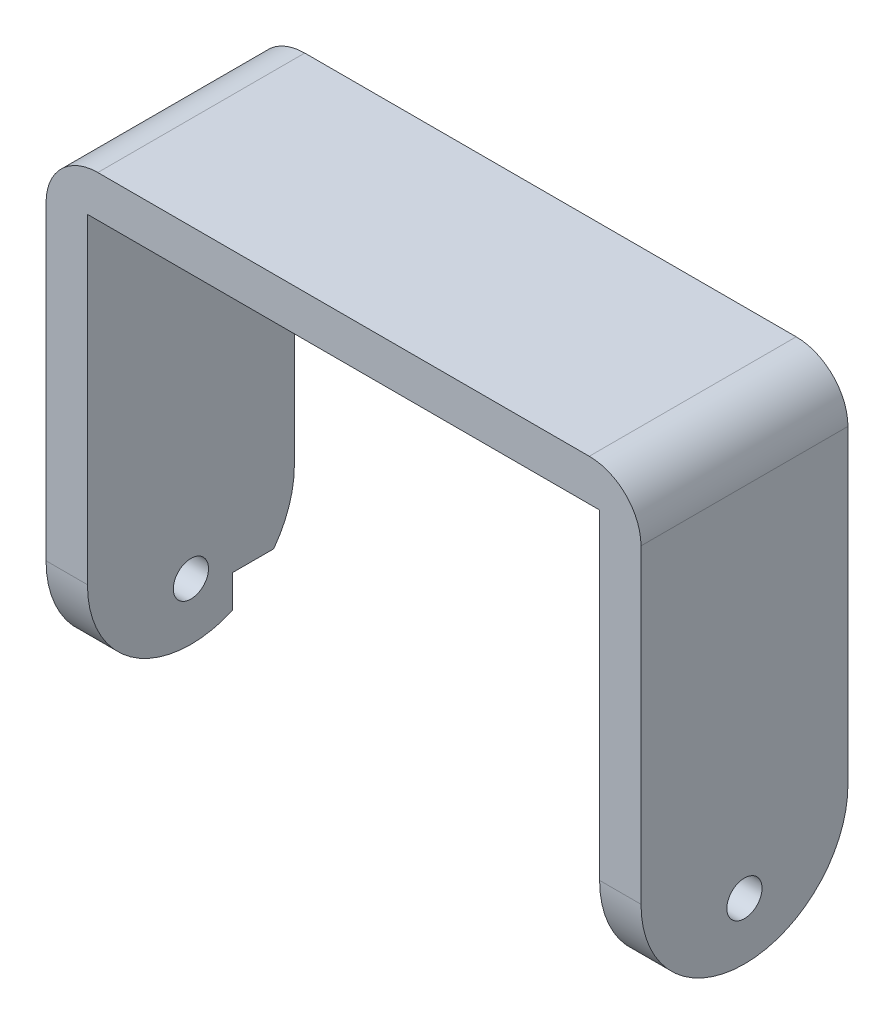
ISO-10303-21;
HEADER;
FILE_DESCRIPTION(('STEP AP214'),'2;1');
FILE_NAME('part.step','',(''),(''),'','','');
FILE_SCHEMA(('AUTOMOTIVE_DESIGN { 1 0 10303 214 1 1 1 1 }'));
ENDSEC;
DATA;
#1=APPLICATION_CONTEXT('core data for automotive mechanical design processes');
#2=APPLICATION_PROTOCOL_DEFINITION('international standard','automotive_design',2000,#1);
#3=PRODUCT_CONTEXT('',#1,'mechanical');
#4=PRODUCT('Part','Part','',(#3));
#5=PRODUCT_RELATED_PRODUCT_CATEGORY('part','',(#4));
#6=PRODUCT_DEFINITION_FORMATION('','',#4);
#7=PRODUCT_DEFINITION_CONTEXT('part definition',#1,'design');
#8=PRODUCT_DEFINITION('design','',#6,#7);
#9=PRODUCT_DEFINITION_SHAPE('','',#8);
#10=(LENGTH_UNIT() NAMED_UNIT(*) SI_UNIT(.MILLI.,.METRE.));
#11=(NAMED_UNIT(*) PLANE_ANGLE_UNIT() SI_UNIT($,.RADIAN.));
#12=(NAMED_UNIT(*) SI_UNIT($,.STERADIAN.) SOLID_ANGLE_UNIT());
#13=UNCERTAINTY_MEASURE_WITH_UNIT(LENGTH_MEASURE(1.E-05),#10,'distance_accuracy_value','');
#14=(GEOMETRIC_REPRESENTATION_CONTEXT(3) GLOBAL_UNCERTAINTY_ASSIGNED_CONTEXT((#13)) GLOBAL_UNIT_ASSIGNED_CONTEXT((#10,
#11,#12)) REPRESENTATION_CONTEXT('',''));
#15=CARTESIAN_POINT('',(0.,0.,0.));
#16=DIRECTION('',(0.,0.,1.));
#17=DIRECTION('',(1.,0.,0.));
#18=AXIS2_PLACEMENT_3D('',#15,#16,#17);
#19=CARTESIAN_POINT('',(0.,10.,10.));
#20=DIRECTION('',(1.,0.,0.));
#21=DIRECTION('',(0.,0.,-1.));
#22=AXIS2_PLACEMENT_3D('',#19,#20,#21);
#23=CYLINDRICAL_SURFACE('',#22,10.);
#24=DIRECTION('',(-1.,0.,0.));
#25=VECTOR('',#24,1.);
#26=CARTESIAN_POINT('',(9.10080222328407,4.,2.));
#27=LINE('',#26,#25);
#28=CARTESIAN_POINT('',(3.99999999999999,4.,2.));
#29=VERTEX_POINT('',#28);
#30=CARTESIAN_POINT('',(0.,4.,2.));
#31=VERTEX_POINT('',#30);
#32=EDGE_CURVE('E298',#29,#31,#27,.T.);
#33=ORIENTED_EDGE('',*,*,#32,.T.);
#34=CARTESIAN_POINT('',(0.,10.,10.));
#35=DIRECTION('',(1.,0.,0.));
#36=DIRECTION('',(0.,0.,-1.));
#37=AXIS2_PLACEMENT_3D('',#34,#35,#36);
#38=CIRCLE('',#37,10.);
#39=CARTESIAN_POINT('',(0.,10.,0.));
#40=VERTEX_POINT('',#39);
#41=EDGE_CURVE('E172',#40,#31,#38,.F.);
#42=ORIENTED_EDGE('',*,*,#41,.F.);
#43=DIRECTION('',(1.,0.,0.));
#44=VECTOR('',#43,1.);
#45=CARTESIAN_POINT('',(0.,10.,0.));
#46=LINE('',#45,#44);
#47=CARTESIAN_POINT('',(3.99999999999999,10.,0.));
#48=VERTEX_POINT('',#47);
#49=EDGE_CURVE('E257',#48,#40,#46,.F.);
#50=ORIENTED_EDGE('',*,*,#49,.F.);
#51=CARTESIAN_POINT('',(3.99999999999999,10.,10.));
#52=DIRECTION('',(-1.,0.,0.));
#53=DIRECTION('',(0.,-1.,0.));
#54=AXIS2_PLACEMENT_3D('',#51,#52,#53);
#55=CIRCLE('',#54,10.);
#56=EDGE_CURVE('E278',#29,#48,#55,.F.);
#57=ORIENTED_EDGE('',*,*,#56,.F.);
#58=EDGE_LOOP('',(#33,#42,#50,#57));
#59=FACE_BOUND('',#58,.T.);
#60=ADVANCED_FACE('F38',(#59),#23,.T.);
#61=CARTESIAN_POINT('',(0.,45.,20.));
#62=DIRECTION('',(1.,0.,0.));
#63=DIRECTION('',(0.,0.,-1.));
#64=AXIS2_PLACEMENT_3D('',#61,#62,#63);
#65=PLANE('',#64);
#66=ORIENTED_EDGE('',*,*,#41,.T.);
#67=DIRECTION('',(0.,0.,-1.));
#68=VECTOR('',#67,1.);
#69=CARTESIAN_POINT('',(0.,4.,2.));
#70=LINE('',#69,#68);
#71=CARTESIAN_POINT('',(0.,4.,6.));
#72=VERTEX_POINT('',#71);
#73=EDGE_CURVE('E156',#72,#31,#70,.T.);
#74=ORIENTED_EDGE('',*,*,#73,.F.);
#75=DIRECTION('',(0.,1.,0.));
#76=VECTOR('',#75,1.);
#77=CARTESIAN_POINT('',(0.,4.,6.));
#78=LINE('',#77,#76);
#79=CARTESIAN_POINT('',(0.,0.83484861008832,6.));
#80=VERTEX_POINT('',#79);
#81=EDGE_CURVE('E148',#80,#72,#78,.T.);
#82=ORIENTED_EDGE('',*,*,#81,.F.);
#83=CARTESIAN_POINT('',(0.,0.,10.));
#84=VERTEX_POINT('',#83);
#85=EDGE_CURVE('E163',#80,#84,#38,.F.);
#86=ORIENTED_EDGE('',*,*,#85,.T.);
#87=CARTESIAN_POINT('',(0.,10.,10.));
#88=DIRECTION('',(1.,0.,0.));
#89=DIRECTION('',(0.,0.,-1.));
#90=AXIS2_PLACEMENT_3D('',#87,#88,#89);
#91=CIRCLE('',#90,10.);
#92=CARTESIAN_POINT('',(0.,10.,20.));
#93=VERTEX_POINT('',#92);
#94=EDGE_CURVE('E173',#84,#93,#91,.F.);
#95=ORIENTED_EDGE('',*,*,#94,.T.);
#96=DIRECTION('',(0.,-1.,0.));
#97=VECTOR('',#96,1.);
#98=CARTESIAN_POINT('',(0.,45.,20.));
#99=LINE('',#98,#97);
#100=CARTESIAN_POINT('',(0.,40.,20.));
#101=VERTEX_POINT('',#100);
#102=EDGE_CURVE('E213',#101,#93,#99,.T.);
#103=ORIENTED_EDGE('',*,*,#102,.F.);
#104=DIRECTION('',(0.,0.,-1.));
#105=VECTOR('',#104,1.);
#106=CARTESIAN_POINT('',(0.,40.,20.));
#107=LINE('',#106,#105);
#108=CARTESIAN_POINT('',(0.,40.,0.));
#109=VERTEX_POINT('',#108);
#110=EDGE_CURVE('E177',#101,#109,#107,.T.);
#111=ORIENTED_EDGE('',*,*,#110,.T.);
#112=DIRECTION('',(0.,-1.,0.));
#113=VECTOR('',#112,1.);
#114=CARTESIAN_POINT('',(0.,45.,0.));
#115=LINE('',#114,#113);
#116=EDGE_CURVE('E231',#109,#40,#115,.T.);
#117=ORIENTED_EDGE('',*,*,#116,.T.);
#118=EDGE_LOOP('',(#66,#74,#82,#86,#95,#103,#111,#117));
#119=FACE_BOUND('',#118,.T.);
#120=CARTESIAN_POINT('',(0.,5.5,10.));
#121=DIRECTION('',(1.,0.,0.));
#122=DIRECTION('',(0.,0.,-1.));
#123=AXIS2_PLACEMENT_3D('',#120,#121,#122);
#124=CIRCLE('',#123,1.69999999999999);
#125=CARTESIAN_POINT('',(0.,5.5,8.30000000000001));
#126=VERTEX_POINT('',#125);
#127=EDGE_CURVE('E343',#126,#126,#124,.F.);
#128=ORIENTED_EDGE('',*,*,#127,.F.);
#129=EDGE_LOOP('',(#128));
#130=FACE_BOUND('',#129,.T.);
#131=ADVANCED_FACE('F160',(#119,#130),#65,.F.);
#132=CARTESIAN_POINT('',(3.99999999999999,0.,20.));
#133=DIRECTION('',(-1.,0.,0.));
#134=DIRECTION('',(0.,-1.,0.));
#135=AXIS2_PLACEMENT_3D('',#132,#133,#134);
#136=PLANE('',#135);
#137=CARTESIAN_POINT('',(3.99999999999999,5.5,10.));
#138=DIRECTION('',(-1.,0.,0.));
#139=DIRECTION('',(0.,-1.,0.));
#140=AXIS2_PLACEMENT_3D('',#137,#138,#139);
#141=CIRCLE('',#140,1.69999999999999);
#142=CARTESIAN_POINT('',(3.99999999999999,3.80000000000001,10.));
#143=VERTEX_POINT('',#142);
#144=EDGE_CURVE('E300',#143,#143,#141,.T.);
#145=ORIENTED_EDGE('',*,*,#144,.T.);
#146=EDGE_LOOP('',(#145));
#147=FACE_BOUND('',#146,.T.);
#148=DIRECTION('',(0.,-1.,0.));
#149=VECTOR('',#148,1.);
#150=CARTESIAN_POINT('',(3.99999999999999,4.,6.));
#151=LINE('',#150,#149);
#152=CARTESIAN_POINT('',(3.99999999999999,4.,6.));
#153=VERTEX_POINT('',#152);
#154=CARTESIAN_POINT('',(3.99999999999999,0.834848610088321,6.));
#155=VERTEX_POINT('',#154);
#156=EDGE_CURVE('E54',#153,#155,#151,.T.);
#157=ORIENTED_EDGE('',*,*,#156,.F.);
#158=DIRECTION('',(0.,0.,1.));
#159=VECTOR('',#158,1.);
#160=CARTESIAN_POINT('',(3.99999999999999,4.,2.));
#161=LINE('',#160,#159);
#162=EDGE_CURVE('E288',#29,#153,#161,.T.);
#163=ORIENTED_EDGE('',*,*,#162,.F.);
#164=ORIENTED_EDGE('',*,*,#56,.T.);
#165=DIRECTION('',(0.,1.,0.));
#166=VECTOR('',#165,1.);
#167=CARTESIAN_POINT('',(3.99999999999999,0.,0.));
#168=LINE('',#167,#166);
#169=CARTESIAN_POINT('',(4.,41.,0.));
#170=VERTEX_POINT('',#169);
#171=EDGE_CURVE('E287',#48,#170,#168,.T.);
#172=ORIENTED_EDGE('',*,*,#171,.T.);
#173=DIRECTION('',(0.,0.,-1.));
#174=VECTOR('',#173,1.);
#175=CARTESIAN_POINT('',(4.,41.,20.));
#176=LINE('',#175,#174);
#177=CARTESIAN_POINT('',(4.,41.,20.));
#178=VERTEX_POINT('',#177);
#179=EDGE_CURVE('E247',#178,#170,#176,.T.);
#180=ORIENTED_EDGE('',*,*,#179,.F.);
#181=DIRECTION('',(0.,1.,0.));
#182=VECTOR('',#181,1.);
#183=CARTESIAN_POINT('',(3.99999999999999,0.,20.));
#184=LINE('',#183,#182);
#185=CARTESIAN_POINT('',(3.99999999999999,10.,20.));
#186=VERTEX_POINT('',#185);
#187=EDGE_CURVE('E222',#186,#178,#184,.T.);
#188=ORIENTED_EDGE('',*,*,#187,.F.);
#189=CARTESIAN_POINT('',(3.99999999999999,10.,10.));
#190=DIRECTION('',(-1.,0.,0.));
#191=DIRECTION('',(0.,-1.,0.));
#192=AXIS2_PLACEMENT_3D('',#189,#190,#191);
#193=CIRCLE('',#192,10.);
#194=CARTESIAN_POINT('',(3.99999999999999,0.,10.));
#195=VERTEX_POINT('',#194);
#196=EDGE_CURVE('E276',#186,#195,#193,.F.);
#197=ORIENTED_EDGE('',*,*,#196,.T.);
#198=EDGE_CURVE('E178',#195,#155,#55,.F.);
#199=ORIENTED_EDGE('',*,*,#198,.T.);
#200=EDGE_LOOP('',(#157,#163,#164,#172,#180,#188,#197,#199));
#201=FACE_BOUND('',#200,.T.);
#202=ADVANCED_FACE('F285',(#147,#201),#136,.F.);
#203=CARTESIAN_POINT('',(4.,41.,20.));
#204=DIRECTION('',(0.,1.,0.));
#205=DIRECTION('',(0.,0.,1.));
#206=AXIS2_PLACEMENT_3D('',#203,#204,#205);
#207=PLANE('',#206);
#208=DIRECTION('',(1.,0.,0.));
#209=VECTOR('',#208,1.);
#210=CARTESIAN_POINT('',(4.,41.,0.));
#211=LINE('',#210,#209);
#212=CARTESIAN_POINT('',(53.5,41.,0.));
#213=VERTEX_POINT('',#212);
#214=EDGE_CURVE('E294',#170,#213,#211,.T.);
#215=ORIENTED_EDGE('',*,*,#214,.T.);
#216=DIRECTION('',(0.,0.,-1.));
#217=VECTOR('',#216,1.);
#218=CARTESIAN_POINT('',(53.5,41.,20.));
#219=LINE('',#218,#217);
#220=CARTESIAN_POINT('',(53.5,41.,20.));
#221=VERTEX_POINT('',#220);
#222=EDGE_CURVE('E243',#221,#213,#219,.T.);
#223=ORIENTED_EDGE('',*,*,#222,.F.);
#224=DIRECTION('',(1.,0.,0.));
#225=VECTOR('',#224,1.);
#226=CARTESIAN_POINT('',(4.,41.,20.));
#227=LINE('',#226,#225);
#228=EDGE_CURVE('E330',#178,#221,#227,.T.);
#229=ORIENTED_EDGE('',*,*,#228,.F.);
#230=ORIENTED_EDGE('',*,*,#179,.T.);
#231=EDGE_LOOP('',(#215,#223,#229,#230));
#232=FACE_BOUND('',#231,.T.);
#233=ADVANCED_FACE('F394',(#232),#207,.F.);
#234=CARTESIAN_POINT('',(53.5,41.,20.));
#235=DIRECTION('',(1.,0.,0.));
#236=DIRECTION('',(0.,1.,0.));
#237=AXIS2_PLACEMENT_3D('',#234,#235,#236);
#238=PLANE('',#237);
#239=CARTESIAN_POINT('',(53.5,5.5,10.));
#240=DIRECTION('',(1.,0.,0.));
#241=DIRECTION('',(0.,1.,0.));
#242=AXIS2_PLACEMENT_3D('',#239,#240,#241);
#243=CIRCLE('',#242,1.69999999999999);
#244=CARTESIAN_POINT('',(53.5,7.19999999999999,10.));
#245=VERTEX_POINT('',#244);
#246=EDGE_CURVE('E304',#245,#245,#243,.T.);
#247=ORIENTED_EDGE('',*,*,#246,.T.);
#248=EDGE_LOOP('',(#247));
#249=FACE_BOUND('',#248,.T.);
#250=DIRECTION('',(0.,-1.,0.));
#251=VECTOR('',#250,1.);
#252=CARTESIAN_POINT('',(53.5,41.,0.));
#253=LINE('',#252,#251);
#254=CARTESIAN_POINT('',(53.5,10.,0.));
#255=VERTEX_POINT('',#254);
#256=EDGE_CURVE('E239',#213,#255,#253,.T.);
#257=ORIENTED_EDGE('',*,*,#256,.T.);
#258=CARTESIAN_POINT('',(53.5,10.,10.));
#259=DIRECTION('',(1.,0.,0.));
#260=DIRECTION('',(0.,1.,0.));
#261=AXIS2_PLACEMENT_3D('',#258,#259,#260);
#262=CIRCLE('',#261,10.);
#263=CARTESIAN_POINT('',(53.5,0.,10.));
#264=VERTEX_POINT('',#263);
#265=EDGE_CURVE('E267',#255,#264,#262,.F.);
#266=ORIENTED_EDGE('',*,*,#265,.T.);
#267=CARTESIAN_POINT('',(53.5,10.,10.));
#268=DIRECTION('',(1.,0.,0.));
#269=DIRECTION('',(0.,1.,0.));
#270=AXIS2_PLACEMENT_3D('',#267,#268,#269);
#271=CIRCLE('',#270,10.);
#272=CARTESIAN_POINT('',(53.5,10.,20.));
#273=VERTEX_POINT('',#272);
#274=EDGE_CURVE('E264',#264,#273,#271,.F.);
#275=ORIENTED_EDGE('',*,*,#274,.T.);
#276=DIRECTION('',(0.,-1.,0.));
#277=VECTOR('',#276,1.);
#278=CARTESIAN_POINT('',(53.5,41.,20.));
#279=LINE('',#278,#277);
#280=EDGE_CURVE('E328',#221,#273,#279,.T.);
#281=ORIENTED_EDGE('',*,*,#280,.F.);
#282=ORIENTED_EDGE('',*,*,#222,.T.);
#283=EDGE_LOOP('',(#257,#266,#275,#281,#282));
#284=FACE_BOUND('',#283,.T.);
#285=ADVANCED_FACE('F313',(#249,#284),#238,.F.);
#286=CARTESIAN_POINT('',(57.5,0.,20.));
#287=DIRECTION('',(-1.,0.,0.));
#288=DIRECTION('',(0.,0.,1.));
#289=AXIS2_PLACEMENT_3D('',#286,#287,#288);
#290=PLANE('',#289);
#291=CARTESIAN_POINT('',(57.5,5.5,10.));
#292=DIRECTION('',(1.,0.,0.));
#293=DIRECTION('',(0.,0.,-1.));
#294=AXIS2_PLACEMENT_3D('',#291,#292,#293);
#295=CIRCLE('',#294,1.69999999999999);
#296=CARTESIAN_POINT('',(57.5,5.5,8.30000000000001));
#297=VERTEX_POINT('',#296);
#298=EDGE_CURVE('E186',#297,#297,#295,.T.);
#299=ORIENTED_EDGE('',*,*,#298,.F.);
#300=EDGE_LOOP('',(#299));
#301=FACE_BOUND('',#300,.T.);
#302=DIRECTION('',(0.,1.,0.));
#303=VECTOR('',#302,1.);
#304=CARTESIAN_POINT('',(57.5,0.,0.));
#305=LINE('',#304,#303);
#306=CARTESIAN_POINT('',(57.5,10.,0.));
#307=VERTEX_POINT('',#306);
#308=CARTESIAN_POINT('',(57.5,40.,0.));
#309=VERTEX_POINT('',#308);
#310=EDGE_CURVE('E236',#307,#309,#305,.T.);
#311=ORIENTED_EDGE('',*,*,#310,.T.);
#312=DIRECTION('',(0.,0.,-1.));
#313=VECTOR('',#312,1.);
#314=CARTESIAN_POINT('',(57.5,40.,20.));
#315=LINE('',#314,#313);
#316=CARTESIAN_POINT('',(57.5,40.,20.));
#317=VERTEX_POINT('',#316);
#318=EDGE_CURVE('E11',#309,#317,#315,.F.);
#319=ORIENTED_EDGE('',*,*,#318,.T.);
#320=DIRECTION('',(0.,1.,0.));
#321=VECTOR('',#320,1.);
#322=CARTESIAN_POINT('',(57.5,0.,20.));
#323=LINE('',#322,#321);
#324=CARTESIAN_POINT('',(57.5,10.,20.));
#325=VERTEX_POINT('',#324);
#326=EDGE_CURVE('E332',#325,#317,#323,.T.);
#327=ORIENTED_EDGE('',*,*,#326,.F.);
#328=CARTESIAN_POINT('',(57.5,10.,10.));
#329=DIRECTION('',(-1.,0.,0.));
#330=DIRECTION('',(0.,0.,1.));
#331=AXIS2_PLACEMENT_3D('',#328,#329,#330);
#332=CIRCLE('',#331,10.);
#333=CARTESIAN_POINT('',(57.5,0.,10.));
#334=VERTEX_POINT('',#333);
#335=EDGE_CURVE('E251',#325,#334,#332,.F.);
#336=ORIENTED_EDGE('',*,*,#335,.T.);
#337=CARTESIAN_POINT('',(57.5,10.,10.));
#338=DIRECTION('',(-1.,0.,0.));
#339=DIRECTION('',(0.,0.,1.));
#340=AXIS2_PLACEMENT_3D('',#337,#338,#339);
#341=CIRCLE('',#340,10.);
#342=EDGE_CURVE('E254',#334,#307,#341,.F.);
#343=ORIENTED_EDGE('',*,*,#342,.T.);
#344=EDGE_LOOP('',(#311,#319,#327,#336,#343));
#345=FACE_BOUND('',#344,.T.);
#346=ADVANCED_FACE('F401',(#301,#345),#290,.F.);
#347=CARTESIAN_POINT('',(57.5,45.,20.));
#348=DIRECTION('',(0.,-1.,0.));
#349=DIRECTION('',(0.,0.,-1.));
#350=AXIS2_PLACEMENT_3D('',#347,#348,#349);
#351=PLANE('',#350);
#352=DIRECTION('',(-1.,0.,0.));
#353=VECTOR('',#352,1.);
#354=CARTESIAN_POINT('',(57.5,45.,0.));
#355=LINE('',#354,#353);
#356=CARTESIAN_POINT('',(52.5,45.,0.));
#357=VERTEX_POINT('',#356);
#358=CARTESIAN_POINT('',(5.,45.,0.));
#359=VERTEX_POINT('',#358);
#360=EDGE_CURVE('E223',#357,#359,#355,.T.);
#361=ORIENTED_EDGE('',*,*,#360,.T.);
#362=DIRECTION('',(0.,0.,-1.));
#363=VECTOR('',#362,1.);
#364=CARTESIAN_POINT('',(5.,45.,20.));
#365=LINE('',#364,#363);
#366=CARTESIAN_POINT('',(5.,45.,20.));
#367=VERTEX_POINT('',#366);
#368=EDGE_CURVE('E202',#359,#367,#365,.F.);
#369=ORIENTED_EDGE('',*,*,#368,.T.);
#370=DIRECTION('',(-1.,0.,0.));
#371=VECTOR('',#370,1.);
#372=CARTESIAN_POINT('',(57.5,45.,20.));
#373=LINE('',#372,#371);
#374=CARTESIAN_POINT('',(52.5,45.,20.));
#375=VERTEX_POINT('',#374);
#376=EDGE_CURVE('E215',#375,#367,#373,.T.);
#377=ORIENTED_EDGE('',*,*,#376,.F.);
#378=DIRECTION('',(0.,0.,-1.));
#379=VECTOR('',#378,1.);
#380=CARTESIAN_POINT('',(52.5,45.,20.));
#381=LINE('',#380,#379);
#382=EDGE_CURVE('E198',#375,#357,#381,.T.);
#383=ORIENTED_EDGE('',*,*,#382,.T.);
#384=EDGE_LOOP('',(#361,#369,#377,#383));
#385=FACE_BOUND('',#384,.T.);
#386=ADVANCED_FACE('F233',(#385),#351,.F.);
#387=CARTESIAN_POINT('',(0.,0.,20.));
#388=DIRECTION('',(0.,0.,1.));
#389=DIRECTION('',(1.,0.,0.));
#390=AXIS2_PLACEMENT_3D('',#387,#388,#389);
#391=PLANE('',#390);
#392=ORIENTED_EDGE('',*,*,#376,.T.);
#393=CARTESIAN_POINT('',(5.,40.,20.));
#394=DIRECTION('',(0.,0.,1.));
#395=DIRECTION('',(1.,0.,0.));
#396=AXIS2_PLACEMENT_3D('',#393,#394,#395);
#397=CIRCLE('',#396,5.);
#398=EDGE_CURVE('E47',#367,#101,#397,.T.);
#399=ORIENTED_EDGE('',*,*,#398,.T.);
#400=ORIENTED_EDGE('',*,*,#102,.T.);
#401=DIRECTION('',(1.,0.,0.));
#402=VECTOR('',#401,1.);
#403=CARTESIAN_POINT('',(3.99999999999999,10.,20.));
#404=LINE('',#403,#402);
#405=EDGE_CURVE('E270',#93,#186,#404,.T.);
#406=ORIENTED_EDGE('',*,*,#405,.T.);
#407=ORIENTED_EDGE('',*,*,#187,.T.);
#408=ORIENTED_EDGE('',*,*,#228,.T.);
#409=ORIENTED_EDGE('',*,*,#280,.T.);
#410=DIRECTION('',(1.,0.,0.));
#411=VECTOR('',#410,1.);
#412=CARTESIAN_POINT('',(57.5,10.,20.));
#413=LINE('',#412,#411);
#414=EDGE_CURVE('E273',#273,#325,#413,.T.);
#415=ORIENTED_EDGE('',*,*,#414,.T.);
#416=ORIENTED_EDGE('',*,*,#326,.T.);
#417=CARTESIAN_POINT('',(52.5,40.,20.));
#418=DIRECTION('',(0.,0.,1.));
#419=DIRECTION('',(1.,0.,0.));
#420=AXIS2_PLACEMENT_3D('',#417,#418,#419);
#421=CIRCLE('',#420,5.);
#422=EDGE_CURVE('E205',#317,#375,#421,.T.);
#423=ORIENTED_EDGE('',*,*,#422,.T.);
#424=EDGE_LOOP('',(#392,#399,#400,#406,#407,#408,#409,#415,#416,#423));
#425=FACE_BOUND('',#424,.T.);
#426=ADVANCED_FACE('F212',(#425),#391,.T.);
#427=CARTESIAN_POINT('',(0.,0.,0.));
#428=DIRECTION('',(0.,0.,1.));
#429=DIRECTION('',(1.,0.,0.));
#430=AXIS2_PLACEMENT_3D('',#427,#428,#429);
#431=PLANE('',#430);
#432=ORIENTED_EDGE('',*,*,#116,.F.);
#433=CARTESIAN_POINT('',(5.,40.,0.));
#434=DIRECTION('',(0.,0.,1.));
#435=DIRECTION('',(1.,0.,0.));
#436=AXIS2_PLACEMENT_3D('',#433,#434,#435);
#437=CIRCLE('',#436,5.);
#438=EDGE_CURVE('E195',#109,#359,#437,.F.);
#439=ORIENTED_EDGE('',*,*,#438,.T.);
#440=ORIENTED_EDGE('',*,*,#360,.F.);
#441=CARTESIAN_POINT('',(52.5,40.,0.));
#442=DIRECTION('',(0.,0.,1.));
#443=DIRECTION('',(1.,0.,0.));
#444=AXIS2_PLACEMENT_3D('',#441,#442,#443);
#445=CIRCLE('',#444,5.);
#446=EDGE_CURVE('E192',#357,#309,#445,.F.);
#447=ORIENTED_EDGE('',*,*,#446,.T.);
#448=ORIENTED_EDGE('',*,*,#310,.F.);
#449=DIRECTION('',(1.,0.,0.));
#450=VECTOR('',#449,1.);
#451=CARTESIAN_POINT('',(0.,10.,0.));
#452=LINE('',#451,#450);
#453=EDGE_CURVE('E260',#307,#255,#452,.F.);
#454=ORIENTED_EDGE('',*,*,#453,.T.);
#455=ORIENTED_EDGE('',*,*,#256,.F.);
#456=ORIENTED_EDGE('',*,*,#214,.F.);
#457=ORIENTED_EDGE('',*,*,#171,.F.);
#458=ORIENTED_EDGE('',*,*,#49,.T.);
#459=EDGE_LOOP('',(#432,#439,#440,#447,#448,#454,#455,#456,#457,#458));
#460=FACE_BOUND('',#459,.T.);
#461=ADVANCED_FACE('F229',(#460),#431,.F.);
#462=CARTESIAN_POINT('',(57.5,5.5,10.));
#463=DIRECTION('',(1.,0.,0.));
#464=DIRECTION('',(0.,0.,-1.));
#465=AXIS2_PLACEMENT_3D('',#462,#463,#464);
#466=CYLINDRICAL_SURFACE('',#465,1.69999999999999);
#467=ORIENTED_EDGE('',*,*,#298,.T.);
#468=EDGE_LOOP('',(#467));
#469=FACE_BOUND('',#468,.T.);
#470=ORIENTED_EDGE('',*,*,#246,.F.);
#471=EDGE_LOOP('',(#470));
#472=FACE_BOUND('',#471,.T.);
#473=ADVANCED_FACE('F412',(#469,#472),#466,.F.);
#474=ORIENTED_EDGE('',*,*,#127,.T.);
#475=EDGE_LOOP('',(#474));
#476=FACE_BOUND('',#475,.T.);
#477=ORIENTED_EDGE('',*,*,#144,.F.);
#478=EDGE_LOOP('',(#477));
#479=FACE_BOUND('',#478,.T.);
#480=ADVANCED_FACE('F408',(#476,#479),#466,.F.);
#481=CARTESIAN_POINT('',(0.,10.,10.));
#482=DIRECTION('',(-1.,0.,0.));
#483=DIRECTION('',(0.,0.,1.));
#484=AXIS2_PLACEMENT_3D('',#481,#482,#483);
#485=CYLINDRICAL_SURFACE('',#484,10.);
#486=ORIENTED_EDGE('',*,*,#414,.F.);
#487=ORIENTED_EDGE('',*,*,#274,.F.);
#488=DIRECTION('',(1.,0.,0.));
#489=VECTOR('',#488,1.);
#490=CARTESIAN_POINT('',(53.5,0.,10.));
#491=LINE('',#490,#489);
#492=EDGE_CURVE('E182',#334,#264,#491,.F.);
#493=ORIENTED_EDGE('',*,*,#492,.F.);
#494=ORIENTED_EDGE('',*,*,#335,.F.);
#495=EDGE_LOOP('',(#486,#487,#493,#494));
#496=FACE_BOUND('',#495,.T.);
#497=ADVANCED_FACE('F326',(#496),#485,.T.);
#498=CARTESIAN_POINT('',(53.5,10.,10.));
#499=DIRECTION('',(1.,0.,0.));
#500=DIRECTION('',(0.,0.,-1.));
#501=AXIS2_PLACEMENT_3D('',#498,#499,#500);
#502=CYLINDRICAL_SURFACE('',#501,10.);
#503=ORIENTED_EDGE('',*,*,#265,.F.);
#504=ORIENTED_EDGE('',*,*,#453,.F.);
#505=ORIENTED_EDGE('',*,*,#342,.F.);
#506=ORIENTED_EDGE('',*,*,#492,.T.);
#507=EDGE_LOOP('',(#503,#504,#505,#506));
#508=FACE_BOUND('',#507,.T.);
#509=ADVANCED_FACE('F321',(#508),#502,.T.);
#510=CARTESIAN_POINT('',(0.,10.,10.));
#511=DIRECTION('',(-1.,0.,0.));
#512=DIRECTION('',(0.,0.,1.));
#513=AXIS2_PLACEMENT_3D('',#510,#511,#512);
#514=CYLINDRICAL_SURFACE('',#513,10.);
#515=ORIENTED_EDGE('',*,*,#405,.F.);
#516=ORIENTED_EDGE('',*,*,#94,.F.);
#517=DIRECTION('',(1.,0.,0.));
#518=VECTOR('',#517,1.);
#519=CARTESIAN_POINT('',(0.,0.,10.));
#520=LINE('',#519,#518);
#521=EDGE_CURVE('E170',#195,#84,#520,.F.);
#522=ORIENTED_EDGE('',*,*,#521,.F.);
#523=ORIENTED_EDGE('',*,*,#196,.F.);
#524=EDGE_LOOP('',(#515,#516,#522,#523));
#525=FACE_BOUND('',#524,.T.);
#526=ADVANCED_FACE('F380',(#525),#514,.T.);
#527=DIRECTION('',(-1.,0.,0.));
#528=VECTOR('',#527,1.);
#529=CARTESIAN_POINT('',(9.10080222328407,0.83484861008832,6.));
#530=LINE('',#529,#528);
#531=EDGE_CURVE('E145',#155,#80,#530,.T.);
#532=ORIENTED_EDGE('',*,*,#531,.F.);
#533=ORIENTED_EDGE('',*,*,#198,.F.);
#534=ORIENTED_EDGE('',*,*,#521,.T.);
#535=ORIENTED_EDGE('',*,*,#85,.F.);
#536=EDGE_LOOP('',(#532,#533,#534,#535));
#537=FACE_BOUND('',#536,.T.);
#538=ADVANCED_FACE('F168',(#537),#23,.T.);
#539=CARTESIAN_POINT('',(5.,40.,20.));
#540=DIRECTION('',(0.,0.,-1.));
#541=DIRECTION('',(-1.,0.,0.));
#542=AXIS2_PLACEMENT_3D('',#539,#540,#541);
#543=CYLINDRICAL_SURFACE('',#542,5.);
#544=ORIENTED_EDGE('',*,*,#398,.F.);
#545=ORIENTED_EDGE('',*,*,#368,.F.);
#546=ORIENTED_EDGE('',*,*,#438,.F.);
#547=ORIENTED_EDGE('',*,*,#110,.F.);
#548=EDGE_LOOP('',(#544,#545,#546,#547));
#549=FACE_BOUND('',#548,.T.);
#550=ADVANCED_FACE('F225',(#549),#543,.T.);
#551=CARTESIAN_POINT('',(52.5,40.,20.));
#552=DIRECTION('',(0.,0.,-1.));
#553=DIRECTION('',(-1.,0.,0.));
#554=AXIS2_PLACEMENT_3D('',#551,#552,#553);
#555=CYLINDRICAL_SURFACE('',#554,5.);
#556=ORIENTED_EDGE('',*,*,#422,.F.);
#557=ORIENTED_EDGE('',*,*,#318,.F.);
#558=ORIENTED_EDGE('',*,*,#446,.F.);
#559=ORIENTED_EDGE('',*,*,#382,.F.);
#560=EDGE_LOOP('',(#556,#557,#558,#559));
#561=FACE_BOUND('',#560,.T.);
#562=ADVANCED_FACE('F40',(#561),#555,.T.);
#563=CARTESIAN_POINT('',(9.10080222328407,4.,2.));
#564=DIRECTION('',(0.,1.,0.));
#565=DIRECTION('',(0.,0.,1.));
#566=AXIS2_PLACEMENT_3D('',#563,#564,#565);
#567=PLANE('',#566);
#568=ORIENTED_EDGE('',*,*,#162,.T.);
#569=DIRECTION('',(-1.,0.,0.));
#570=VECTOR('',#569,1.);
#571=CARTESIAN_POINT('',(9.10080222328407,4.,6.));
#572=LINE('',#571,#570);
#573=EDGE_CURVE('E155',#153,#72,#572,.T.);
#574=ORIENTED_EDGE('',*,*,#573,.T.);
#575=ORIENTED_EDGE('',*,*,#73,.T.);
#576=ORIENTED_EDGE('',*,*,#32,.F.);
#577=EDGE_LOOP('',(#568,#574,#575,#576));
#578=FACE_BOUND('',#577,.T.);
#579=ADVANCED_FACE('F360',(#578),#567,.F.);
#580=CARTESIAN_POINT('',(9.10080222328407,4.,6.));
#581=DIRECTION('',(0.,0.,1.));
#582=DIRECTION('',(1.,0.,0.));
#583=AXIS2_PLACEMENT_3D('',#580,#581,#582);
#584=PLANE('',#583);
#585=ORIENTED_EDGE('',*,*,#156,.T.);
#586=ORIENTED_EDGE('',*,*,#531,.T.);
#587=ORIENTED_EDGE('',*,*,#81,.T.);
#588=ORIENTED_EDGE('',*,*,#573,.F.);
#589=EDGE_LOOP('',(#585,#586,#587,#588));
#590=FACE_BOUND('',#589,.T.);
#591=ADVANCED_FACE('F147',(#590),#584,.F.);
#592=CLOSED_SHELL('',(#60,#131,#202,#233,#285,#346,#386,#426,#461,#473,#480,#497,#509,#526,#538,
#550,#562,#579,#591));
#593=MANIFOLD_SOLID_BREP('B2',#592);
#594=ADVANCED_BREP_SHAPE_REPRESENTATION('',(#18,#593),#14);
#595=SHAPE_DEFINITION_REPRESENTATION(#9,#594);
ENDSEC;
END-ISO-10303-21;
